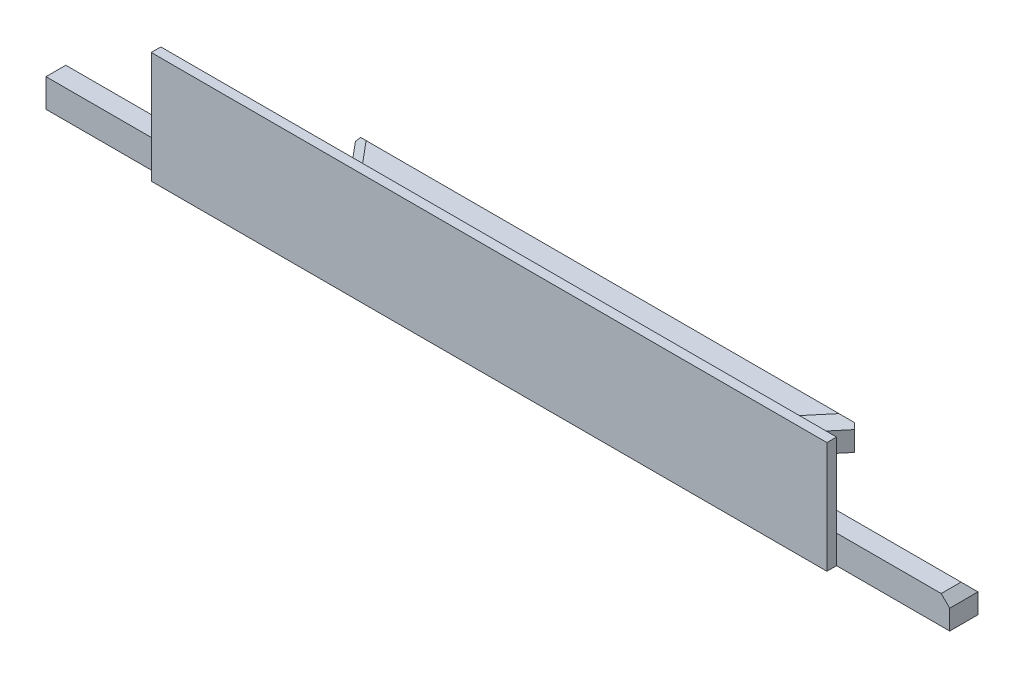
ISO-10303-21;
HEADER;
FILE_DESCRIPTION(('STEP AP214'),'2;1');
FILE_NAME('part.step','',(''),(''),'','','');
FILE_SCHEMA(('AUTOMOTIVE_DESIGN { 1 0 10303 214 1 1 1 1 }'));
ENDSEC;
DATA;
#1=APPLICATION_CONTEXT('core data for automotive mechanical design processes');
#2=APPLICATION_PROTOCOL_DEFINITION('international standard','automotive_design',2000,#1);
#3=PRODUCT_CONTEXT('',#1,'mechanical');
#4=PRODUCT('Part','Part','',(#3));
#5=PRODUCT_RELATED_PRODUCT_CATEGORY('part','',(#4));
#6=PRODUCT_DEFINITION_FORMATION('','',#4);
#7=PRODUCT_DEFINITION_CONTEXT('part definition',#1,'design');
#8=PRODUCT_DEFINITION('design','',#6,#7);
#9=PRODUCT_DEFINITION_SHAPE('','',#8);
#10=(LENGTH_UNIT() NAMED_UNIT(*) SI_UNIT(.MILLI.,.METRE.));
#11=(NAMED_UNIT(*) PLANE_ANGLE_UNIT() SI_UNIT($,.RADIAN.));
#12=(NAMED_UNIT(*) SI_UNIT($,.STERADIAN.) SOLID_ANGLE_UNIT());
#13=UNCERTAINTY_MEASURE_WITH_UNIT(LENGTH_MEASURE(1.E-05),#10,'distance_accuracy_value','');
#14=(GEOMETRIC_REPRESENTATION_CONTEXT(3) GLOBAL_UNCERTAINTY_ASSIGNED_CONTEXT((#13)) GLOBAL_UNIT_ASSIGNED_CONTEXT((#10,
#11,#12)) REPRESENTATION_CONTEXT('',''));
#15=CARTESIAN_POINT('',(0.,0.,0.));
#16=DIRECTION('',(0.,0.,1.));
#17=DIRECTION('',(1.,0.,0.));
#18=AXIS2_PLACEMENT_3D('',#15,#16,#17);
#19=CARTESIAN_POINT('',(185.4335,74.497,-9.29));
#20=DIRECTION('',(0.,-1.,0.));
#21=DIRECTION('',(0.,0.,-1.));
#22=AXIS2_PLACEMENT_3D('',#19,#20,#21);
#23=PLANE('',#22);
#24=DIRECTION('',(0.707106781186557,0.,0.707106781186539));
#25=VECTOR('',#24,1.);
#26=CARTESIAN_POINT('',(149.670988663526,74.497,-29.9125113364741));
#27=LINE('',#26,#25);
#28=CARTESIAN_POINT('',(149.670988663526,74.497,-29.9125113364741));
#29=VERTEX_POINT('',#28);
#30=CARTESIAN_POINT('',(148.5835,74.497,-31.));
#31=VERTEX_POINT('',#30);
#32=EDGE_CURVE('E354',#29,#31,#27,.F.);
#33=ORIENTED_EDGE('',*,*,#32,.F.);
#34=DIRECTION('',(0.642787609686543,0.,-0.766044443118975));
#35=VECTOR('',#34,1.);
#36=CARTESIAN_POINT('',(137.997005532341,74.497,-16.));
#37=LINE('',#36,#35);
#38=CARTESIAN_POINT('',(139.282580751714,74.497,-17.5320888862379));
#39=VERTEX_POINT('',#38);
#40=EDGE_CURVE('E352',#39,#29,#37,.T.);
#41=ORIENTED_EDGE('',*,*,#40,.F.);
#42=DIRECTION('',(-0.0871557427476733,0.,-0.996194698091744));
#43=VECTOR('',#42,1.);
#44=CARTESIAN_POINT('',(139.416621160774,74.497,-16.));
#45=LINE('',#44,#43);
#46=CARTESIAN_POINT('',(139.416621160774,74.497,-16.));
#47=VERTEX_POINT('',#46);
#48=EDGE_CURVE('E363',#39,#47,#45,.F.);
#49=ORIENTED_EDGE('',*,*,#48,.T.);
#50=DIRECTION('',(-1.,0.,0.));
#51=VECTOR('',#50,1.);
#52=CARTESIAN_POINT('',(0.,74.497,-16.));
#53=LINE('',#52,#51);
#54=CARTESIAN_POINT('',(185.4335,74.497,-16.));
#55=VERTEX_POINT('',#54);
#56=EDGE_CURVE('E347',#55,#47,#53,.T.);
#57=ORIENTED_EDGE('',*,*,#56,.F.);
#58=DIRECTION('',(0.,0.,1.));
#59=VECTOR('',#58,1.);
#60=CARTESIAN_POINT('',(185.4335,74.497,-16.));
#61=LINE('',#60,#59);
#62=CARTESIAN_POINT('',(185.4335,74.497,-11.));
#63=VERTEX_POINT('',#62);
#64=EDGE_CURVE('E366',#55,#63,#61,.T.);
#65=ORIENTED_EDGE('',*,*,#64,.T.);
#66=DIRECTION('',(-1.,0.,0.));
#67=VECTOR('',#66,1.);
#68=CARTESIAN_POINT('',(0.,74.497,-11.));
#69=LINE('',#68,#67);
#70=CARTESIAN_POINT('',(165.4335,74.497,-11.));
#71=VERTEX_POINT('',#70);
#72=EDGE_CURVE('E369',#63,#71,#69,.T.);
#73=ORIENTED_EDGE('',*,*,#72,.T.);
#74=DIRECTION('',(0.,0.,1.));
#75=VECTOR('',#74,1.);
#76=CARTESIAN_POINT('',(165.4335,74.497,-166.552081310409));
#77=LINE('',#76,#75);
#78=CARTESIAN_POINT('',(165.4335,74.497,-9.3));
#79=VERTEX_POINT('',#78);
#80=EDGE_CURVE('E213',#71,#79,#77,.T.);
#81=ORIENTED_EDGE('',*,*,#80,.T.);
#82=DIRECTION('',(-1.,0.,0.));
#83=VECTOR('',#82,1.);
#84=CARTESIAN_POINT('',(0.,74.497,-9.3));
#85=LINE('',#84,#83);
#86=CARTESIAN_POINT('',(46.0335,74.497,-9.3));
#87=VERTEX_POINT('',#86);
#88=EDGE_CURVE('E200',#79,#87,#85,.T.);
#89=ORIENTED_EDGE('',*,*,#88,.T.);
#90=DIRECTION('',(0.,0.,-1.));
#91=VECTOR('',#90,1.);
#92=CARTESIAN_POINT('',(46.0335,74.497,-166.552081310409));
#93=LINE('',#92,#91);
#94=CARTESIAN_POINT('',(46.0335,74.497,-11.));
#95=VERTEX_POINT('',#94);
#96=EDGE_CURVE('E207',#87,#95,#93,.T.);
#97=ORIENTED_EDGE('',*,*,#96,.T.);
#98=DIRECTION('',(-1.,0.,0.));
#99=VECTOR('',#98,1.);
#100=CARTESIAN_POINT('',(0.,74.497,-11.));
#101=LINE('',#100,#99);
#102=CARTESIAN_POINT('',(25.7335,74.497,-11.));
#103=VERTEX_POINT('',#102);
#104=EDGE_CURVE('E361',#95,#103,#101,.T.);
#105=ORIENTED_EDGE('',*,*,#104,.T.);
#106=DIRECTION('',(0.,0.,-1.));
#107=VECTOR('',#106,1.);
#108=CARTESIAN_POINT('',(25.7335,74.497,-9.29));
#109=LINE('',#108,#107);
#110=CARTESIAN_POINT('',(25.7335,74.497,-16.));
#111=VERTEX_POINT('',#110);
#112=EDGE_CURVE('E371',#103,#111,#109,.T.);
#113=ORIENTED_EDGE('',*,*,#112,.T.);
#114=DIRECTION('',(-1.,0.,0.));
#115=VECTOR('',#114,1.);
#116=CARTESIAN_POINT('',(0.,74.497,-16.));
#117=LINE('',#116,#115);
#118=CARTESIAN_POINT('',(71.7503788392264,74.497,-16.));
#119=VERTEX_POINT('',#118);
#120=EDGE_CURVE('E225',#119,#111,#117,.T.);
#121=ORIENTED_EDGE('',*,*,#120,.F.);
#122=DIRECTION('',(-0.0871557427476643,0.,0.996194698091745));
#123=VECTOR('',#122,1.);
#124=CARTESIAN_POINT('',(71.8844192482863,74.497,-17.5320888862379));
#125=LINE('',#124,#123);
#126=CARTESIAN_POINT('',(71.8844192482863,74.497,-17.5320888862379));
#127=VERTEX_POINT('',#126);
#128=EDGE_CURVE('E374',#119,#127,#125,.F.);
#129=ORIENTED_EDGE('',*,*,#128,.T.);
#130=DIRECTION('',(0.642787609686543,0.,0.766044443118975));
#131=VECTOR('',#130,1.);
#132=CARTESIAN_POINT('',(60.5835,74.497,-31.));
#133=LINE('',#132,#131);
#134=CARTESIAN_POINT('',(61.4960113364741,74.497,-29.9125113364741));
#135=VERTEX_POINT('',#134);
#136=EDGE_CURVE('E349',#135,#127,#133,.T.);
#137=ORIENTED_EDGE('',*,*,#136,.F.);
#138=DIRECTION('',(0.707106781186552,0.,-0.707106781186543));
#139=VECTOR('',#138,1.);
#140=CARTESIAN_POINT('',(62.5835,74.497,-31.));
#141=LINE('',#140,#139);
#142=CARTESIAN_POINT('',(62.5835,74.497,-31.));
#143=VERTEX_POINT('',#142);
#144=EDGE_CURVE('E358',#143,#135,#141,.F.);
#145=ORIENTED_EDGE('',*,*,#144,.F.);
#146=DIRECTION('',(-1.,0.,0.));
#147=VECTOR('',#146,1.);
#148=CARTESIAN_POINT('',(150.5835,74.497,-31.));
#149=LINE('',#148,#147);
#150=EDGE_CURVE('E356',#31,#143,#149,.T.);
#151=ORIENTED_EDGE('',*,*,#150,.F.);
#152=EDGE_LOOP('',(#33,#41,#49,#57,#65,#73,#81,#89,#97,#105,#113,#121,#129,#137,#145,#151));
#153=FACE_BOUND('',#152,.T.);
#154=ADVANCED_FACE('F40',(#153),#23,.T.);
#155=CARTESIAN_POINT('',(150.5835,-96.7444379544733,-31.));
#156=DIRECTION('',(0.,0.,-1.));
#157=DIRECTION('',(-1.,0.,0.));
#158=AXIS2_PLACEMENT_3D('',#155,#156,#157);
#159=PLANE('',#158);
#160=DIRECTION('',(0.,-1.,0.));
#161=VECTOR('',#160,1.);
#162=CARTESIAN_POINT('',(148.5835,-96.7444379544733,-31.));
#163=LINE('',#162,#161);
#164=CARTESIAN_POINT('',(148.5835,77.997,-31.));
#165=VERTEX_POINT('',#164);
#166=EDGE_CURVE('E238',#165,#31,#163,.T.);
#167=ORIENTED_EDGE('',*,*,#166,.T.);
#168=ORIENTED_EDGE('',*,*,#150,.T.);
#169=DIRECTION('',(0.,1.,0.));
#170=VECTOR('',#169,1.);
#171=CARTESIAN_POINT('',(62.5835,-96.7444379544733,-31.));
#172=LINE('',#171,#170);
#173=CARTESIAN_POINT('',(62.5835,77.997,-31.));
#174=VERTEX_POINT('',#173);
#175=EDGE_CURVE('E241',#143,#174,#172,.T.);
#176=ORIENTED_EDGE('',*,*,#175,.T.);
#177=DIRECTION('',(1.,0.,0.));
#178=VECTOR('',#177,1.);
#179=CARTESIAN_POINT('',(148.5835,77.997,-31.));
#180=LINE('',#179,#178);
#181=EDGE_CURVE('E298',#174,#165,#180,.T.);
#182=ORIENTED_EDGE('',*,*,#181,.T.);
#183=EDGE_LOOP('',(#167,#168,#176,#182));
#184=FACE_BOUND('',#183,.T.);
#185=ADVANCED_FACE('F394',(#184),#159,.T.);
#186=CARTESIAN_POINT('',(149.670988663526,-96.7444379544733,-29.9125113364741));
#187=DIRECTION('',(-0.707106781186538,0.,0.707106781186556));
#188=DIRECTION('',(0.,1.,0.));
#189=AXIS2_PLACEMENT_3D('',#186,#187,#188);
#190=PLANE('',#189);
#191=DIRECTION('',(0.,1.,0.));
#192=VECTOR('',#191,1.);
#193=CARTESIAN_POINT('',(149.670988663526,-96.7444379544733,-29.9125113364741));
#194=LINE('',#193,#192);
#195=CARTESIAN_POINT('',(149.670988663526,77.997,-29.9125113364741));
#196=VERTEX_POINT('',#195);
#197=EDGE_CURVE('E245',#29,#196,#194,.T.);
#198=ORIENTED_EDGE('',*,*,#197,.F.);
#199=ORIENTED_EDGE('',*,*,#32,.T.);
#200=ORIENTED_EDGE('',*,*,#166,.F.);
#201=DIRECTION('',(-0.577350269189636,-0.577350269189621,-0.577350269189621));
#202=VECTOR('',#201,1.);
#203=CARTESIAN_POINT('',(81.0613464575256,10.4748464575274,-98.5221535424726));
#204=LINE('',#203,#202);
#205=CARTESIAN_POINT('',(149.219529765734,78.6330297657338,-30.3639702342662));
#206=VERTEX_POINT('',#205);
#207=EDGE_CURVE('E293',#165,#206,#204,.F.);
#208=ORIENTED_EDGE('',*,*,#207,.T.);
#209=DIRECTION('',(-0.500952228764619,0.705757556807955,-0.500952228764607));
#210=VECTOR('',#209,1.);
#211=CARTESIAN_POINT('',(222.057492155373,-23.9834263098323,42.4739921553712));
#212=LINE('',#211,#210);
#213=EDGE_CURVE('E295',#206,#196,#212,.F.);
#214=ORIENTED_EDGE('',*,*,#213,.T.);
#215=EDGE_LOOP('',(#198,#199,#200,#208,#214));
#216=FACE_BOUND('',#215,.T.);
#217=ADVANCED_FACE('F398',(#216),#190,.F.);
#218=CARTESIAN_POINT('',(137.997005532341,-96.7444379544733,-16.));
#219=DIRECTION('',(0.766044443118975,0.,0.642787609686543));
#220=DIRECTION('',(0.642787609686543,0.,-0.766044443118975));
#221=AXIS2_PLACEMENT_3D('',#218,#219,#220);
#222=PLANE('',#221);
#223=DIRECTION('',(0.,-1.,0.));
#224=VECTOR('',#223,1.);
#225=CARTESIAN_POINT('',(139.282580751714,-5.50299999999999,-17.5320888862379));
#226=LINE('',#225,#224);
#227=CARTESIAN_POINT('',(139.282580751714,77.997,-17.5320888862379));
#228=VERTEX_POINT('',#227);
#229=EDGE_CURVE('E243',#228,#39,#226,.T.);
#230=ORIENTED_EDGE('',*,*,#229,.T.);
#231=ORIENTED_EDGE('',*,*,#40,.T.);
#232=ORIENTED_EDGE('',*,*,#197,.T.);
#233=DIRECTION('',(-0.642787609686543,0.,0.766044443118975));
#234=VECTOR('',#233,1.);
#235=CARTESIAN_POINT('',(139.282580751714,77.997,-17.5320888862379));
#236=LINE('',#235,#234);
#237=EDGE_CURVE('E290',#196,#228,#236,.T.);
#238=ORIENTED_EDGE('',*,*,#237,.T.);
#239=EDGE_LOOP('',(#230,#231,#232,#238));
#240=FACE_BOUND('',#239,.T.);
#241=ADVANCED_FACE('F402',(#240),#222,.T.);
#242=CARTESIAN_POINT('',(62.5835,-96.7444379544733,-31.));
#243=DIRECTION('',(0.707106781186543,0.,0.707106781186552));
#244=DIRECTION('',(0.,1.,0.));
#245=AXIS2_PLACEMENT_3D('',#242,#243,#244);
#246=PLANE('',#245);
#247=ORIENTED_EDGE('',*,*,#175,.F.);
#248=ORIENTED_EDGE('',*,*,#144,.T.);
#249=DIRECTION('',(0.,-1.,0.));
#250=VECTOR('',#249,1.);
#251=CARTESIAN_POINT('',(61.4960113364741,-96.7444379544733,-29.9125113364741));
#252=LINE('',#251,#250);
#253=CARTESIAN_POINT('',(61.4960113364741,77.997,-29.9125113364741));
#254=VERTEX_POINT('',#253);
#255=EDGE_CURVE('E231',#254,#135,#252,.T.);
#256=ORIENTED_EDGE('',*,*,#255,.F.);
#257=DIRECTION('',(-0.500952228764616,-0.705757556807956,0.500952228764609));
#258=VECTOR('',#257,1.);
#259=CARTESIAN_POINT('',(-10.3446747754983,-23.2144612900873,41.9281747754974));
#260=LINE('',#259,#258);
#261=CARTESIAN_POINT('',(61.9474702342662,78.6330297657338,-30.3639702342662));
#262=VERTEX_POINT('',#261);
#263=EDGE_CURVE('E301',#254,#262,#260,.F.);
#264=ORIENTED_EDGE('',*,*,#263,.T.);
#265=DIRECTION('',(-0.577350269189631,0.577350269189623,0.577350269189623));
#266=VECTOR('',#265,1.);
#267=CARTESIAN_POINT('',(130.830645984825,9.74985401517617,-99.2471459848238));
#268=LINE('',#267,#266);
#269=EDGE_CURVE('E303',#262,#174,#268,.F.);
#270=ORIENTED_EDGE('',*,*,#269,.T.);
#271=EDGE_LOOP('',(#247,#248,#256,#264,#270));
#272=FACE_BOUND('',#271,.T.);
#273=ADVANCED_FACE('F388',(#272),#246,.F.);
#274=CARTESIAN_POINT('',(60.5835,-96.7444379544733,-31.));
#275=DIRECTION('',(-0.766044443118975,0.,0.642787609686543));
#276=DIRECTION('',(0.642787609686543,0.,0.766044443118975));
#277=AXIS2_PLACEMENT_3D('',#274,#275,#276);
#278=PLANE('',#277);
#279=ORIENTED_EDGE('',*,*,#255,.T.);
#280=ORIENTED_EDGE('',*,*,#136,.T.);
#281=DIRECTION('',(0.,1.,0.));
#282=VECTOR('',#281,1.);
#283=CARTESIAN_POINT('',(71.8844192482863,109.497,-17.5320888862379));
#284=LINE('',#283,#282);
#285=CARTESIAN_POINT('',(71.8844192482863,77.997,-17.5320888862379));
#286=VERTEX_POINT('',#285);
#287=EDGE_CURVE('E234',#127,#286,#284,.T.);
#288=ORIENTED_EDGE('',*,*,#287,.T.);
#289=DIRECTION('',(-0.642787609686543,0.,-0.766044443118975));
#290=VECTOR('',#289,1.);
#291=CARTESIAN_POINT('',(61.4960113364741,77.997,-29.9125113364741));
#292=LINE('',#291,#290);
#293=EDGE_CURVE('E306',#286,#254,#292,.T.);
#294=ORIENTED_EDGE('',*,*,#293,.T.);
#295=EDGE_LOOP('',(#279,#280,#288,#294));
#296=FACE_BOUND('',#295,.T.);
#297=ADVANCED_FACE('F384',(#296),#278,.T.);
#298=CARTESIAN_POINT('',(0.,0.,-16.));
#299=DIRECTION('',(0.,0.,-1.));
#300=DIRECTION('',(-1.,0.,0.));
#301=AXIS2_PLACEMENT_3D('',#298,#299,#300);
#302=PLANE('',#301);
#303=DIRECTION('',(0.,-1.,0.));
#304=VECTOR('',#303,1.);
#305=CARTESIAN_POINT('',(71.7503788392264,-5.50299999999999,-16.));
#306=LINE('',#305,#304);
#307=CARTESIAN_POINT('',(71.7503788392264,77.997,-16.));
#308=VERTEX_POINT('',#307);
#309=EDGE_CURVE('E236',#308,#119,#306,.T.);
#310=ORIENTED_EDGE('',*,*,#309,.T.);
#311=ORIENTED_EDGE('',*,*,#120,.T.);
#312=DIRECTION('',(0.,1.,0.));
#313=VECTOR('',#312,1.);
#314=CARTESIAN_POINT('',(25.7335,109.497,-16.));
#315=LINE('',#314,#313);
#316=CARTESIAN_POINT('',(25.7335,77.997,-16.));
#317=VERTEX_POINT('',#316);
#318=EDGE_CURVE('E229',#111,#317,#315,.T.);
#319=ORIENTED_EDGE('',*,*,#318,.T.);
#320=DIRECTION('',(1.,0.,0.));
#321=VECTOR('',#320,1.);
#322=CARTESIAN_POINT('',(71.7503788392264,77.997,-16.));
#323=LINE('',#322,#321);
#324=EDGE_CURVE('E331',#317,#308,#323,.T.);
#325=ORIENTED_EDGE('',*,*,#324,.T.);
#326=EDGE_LOOP('',(#310,#311,#319,#325));
#327=FACE_BOUND('',#326,.T.);
#328=ADVANCED_FACE('F438',(#327),#302,.T.);
#329=CARTESIAN_POINT('',(120.703637321413,79.497,38.3148038997593));
#330=DIRECTION('',(-0.541675220419702,0.707106781186544,0.454519477672049));
#331=DIRECTION('',(-0.642787609686543,0.,-0.766044443118975));
#332=AXIS2_PLACEMENT_3D('',#329,#330,#331);
#333=PLANE('',#332);
#334=ORIENTED_EDGE('',*,*,#263,.F.);
#335=ORIENTED_EDGE('',*,*,#293,.F.);
#336=DIRECTION('',(0.7005142133454,0.678598344545849,-0.220871283060313));
#337=VECTOR('',#336,1.);
#338=CARTESIAN_POINT('',(74.9586457992077,80.9750481373124,-18.501388794483));
#339=LINE('',#338,#337);
#340=CARTESIAN_POINT('',(73.4328629314511,79.497,-18.0203113041871));
#341=VERTEX_POINT('',#340);
#342=EDGE_CURVE('E273',#341,#286,#339,.F.);
#343=ORIENTED_EDGE('',*,*,#342,.F.);
#344=DIRECTION('',(0.642787609686543,0.,0.766044443118975));
#345=VECTOR('',#344,1.);
#346=CARTESIAN_POINT('',(73.0334859129647,79.497,-18.4962703007677));
#347=LINE('',#346,#345);
#348=CARTESIAN_POINT('',(63.8002603807643,79.497,-29.5));
#349=VERTEX_POINT('',#348);
#350=EDGE_CURVE('E319',#349,#341,#347,.T.);
#351=ORIENTED_EDGE('',*,*,#350,.F.);
#352=DIRECTION('',(0.834817129478988,0.389281620635025,0.389281620635025));
#353=VECTOR('',#352,1.);
#354=CARTESIAN_POINT('',(148.568853908284,119.025244332911,10.0282443329105));
#355=LINE('',#354,#353);
#356=EDGE_CURVE('E270',#349,#262,#355,.F.);
#357=ORIENTED_EDGE('',*,*,#356,.T.);
#358=EDGE_LOOP('',(#334,#335,#343,#351,#357));
#359=FACE_BOUND('',#358,.T.);
#360=ADVANCED_FACE('F449',(#359),#333,.T.);
#361=CARTESIAN_POINT('',(185.4335,79.497,-29.5));
#362=DIRECTION('',(0.,0.707106781186547,-0.707106781186547));
#363=DIRECTION('',(1.,0.,0.));
#364=AXIS2_PLACEMENT_3D('',#361,#362,#363);
#365=PLANE('',#364);
#366=ORIENTED_EDGE('',*,*,#181,.F.);
#367=ORIENTED_EDGE('',*,*,#269,.F.);
#368=ORIENTED_EDGE('',*,*,#356,.F.);
#369=DIRECTION('',(-1.,0.,0.));
#370=VECTOR('',#369,1.);
#371=CARTESIAN_POINT('',(62.5835,79.497,-29.5));
#372=LINE('',#371,#370);
#373=CARTESIAN_POINT('',(147.366739619236,79.497,-29.5));
#374=VERTEX_POINT('',#373);
#375=EDGE_CURVE('E321',#374,#349,#372,.T.);
#376=ORIENTED_EDGE('',*,*,#375,.F.);
#377=DIRECTION('',(-0.834817129478988,0.389281620635024,0.389281620635024));
#378=VECTOR('',#377,1.);
#379=CARTESIAN_POINT('',(157.212291975728,74.9059435374016,-34.0910564625984));
#380=LINE('',#379,#378);
#381=EDGE_CURVE('E267',#374,#206,#380,.F.);
#382=ORIENTED_EDGE('',*,*,#381,.T.);
#383=ORIENTED_EDGE('',*,*,#207,.F.);
#384=EDGE_LOOP('',(#366,#367,#368,#376,#382,#383));
#385=FACE_BOUND('',#384,.T.);
#386=ADVANCED_FACE('F453',(#385),#365,.T.);
#387=CARTESIAN_POINT('',(156.447555691884,79.497,-40.3220951782657));
#388=DIRECTION('',(0.541675220419701,0.707106781186545,0.454519477672048));
#389=DIRECTION('',(-0.642787609686543,0.,0.766044443118975));
#390=AXIS2_PLACEMENT_3D('',#387,#388,#389);
#391=PLANE('',#390);
#392=ORIENTED_EDGE('',*,*,#237,.F.);
#393=ORIENTED_EDGE('',*,*,#213,.F.);
#394=ORIENTED_EDGE('',*,*,#381,.F.);
#395=DIRECTION('',(0.642787609686543,0.,-0.766044443118975));
#396=VECTOR('',#395,1.);
#397=CARTESIAN_POINT('',(148.521921998847,79.497,-30.8766927510039));
#398=LINE('',#397,#396);
#399=CARTESIAN_POINT('',(137.734137068549,79.497,-18.0203113041871));
#400=VERTEX_POINT('',#399);
#401=EDGE_CURVE('E323',#400,#374,#398,.T.);
#402=ORIENTED_EDGE('',*,*,#401,.F.);
#403=DIRECTION('',(-0.7005142133454,0.678598344545848,-0.220871283060315));
#404=VECTOR('',#403,1.);
#405=CARTESIAN_POINT('',(143.466579450127,73.9438993830029,-16.2128791639569));
#406=LINE('',#405,#404);
#407=EDGE_CURVE('E264',#400,#228,#406,.F.);
#408=ORIENTED_EDGE('',*,*,#407,.T.);
#409=EDGE_LOOP('',(#392,#393,#394,#402,#408));
#410=FACE_BOUND('',#409,.T.);
#411=ADVANCED_FACE('F457',(#410),#391,.T.);
#412=CARTESIAN_POINT('',(138.271879008103,79.497,-11.873892809702));
#413=DIRECTION('',(0.70441602640276,0.707106781186545,-0.0616284167162302));
#414=DIRECTION('',(0.0871557427476733,0.,0.996194698091744));
#415=AXIS2_PLACEMENT_3D('',#412,#413,#414);
#416=PLANE('',#415);
#417=DIRECTION('',(-0.543774795917189,0.59342605745165,0.59342605745165));
#418=VECTOR('',#417,1.);
#419=CARTESIAN_POINT('',(137.262641896983,80.3476558817019,-13.6493441182981));
#420=LINE('',#419,#418);
#421=CARTESIAN_POINT('',(138.042124399748,79.497,-14.5));
#422=VERTEX_POINT('',#421);
#423=CARTESIAN_POINT('',(139.416621160774,77.997,-16.));
#424=VERTEX_POINT('',#423);
#425=EDGE_CURVE('E260',#422,#424,#420,.F.);
#426=ORIENTED_EDGE('',*,*,#425,.T.);
#427=DIRECTION('',(-0.0871557427476733,0.,-0.996194698091744));
#428=VECTOR('',#427,1.);
#429=CARTESIAN_POINT('',(139.416621160774,77.997,-16.));
#430=LINE('',#429,#428);
#431=EDGE_CURVE('E287',#228,#424,#430,.F.);
#432=ORIENTED_EDGE('',*,*,#431,.F.);
#433=ORIENTED_EDGE('',*,*,#407,.F.);
#434=DIRECTION('',(-0.0871557427476733,0.,-0.996194698091744));
#435=VECTOR('',#434,1.);
#436=CARTESIAN_POINT('',(138.271879008103,79.497,-11.873892809702));
#437=LINE('',#436,#435);
#438=EDGE_CURVE('E325',#422,#400,#437,.T.);
#439=ORIENTED_EDGE('',*,*,#438,.F.);
#440=EDGE_LOOP('',(#426,#432,#433,#439));
#441=FACE_BOUND('',#440,.T.);
#442=ADVANCED_FACE('F461',(#441),#416,.T.);
#443=CARTESIAN_POINT('',(0.,77.997,-16.));
#444=DIRECTION('',(0.,0.707106781186547,-0.707106781186547));
#445=DIRECTION('',(-1.,0.,0.));
#446=AXIS2_PLACEMENT_3D('',#443,#444,#445);
#447=PLANE('',#446);
#448=DIRECTION('',(0.577350269189626,-0.577350269189626,-0.577350269189626));
#449=VECTOR('',#448,1.);
#450=CARTESIAN_POINT('',(185.4335,77.997,-16.));
#451=LINE('',#450,#449);
#452=CARTESIAN_POINT('',(183.9335,79.497,-14.5));
#453=VERTEX_POINT('',#452);
#454=CARTESIAN_POINT('',(185.4335,77.997,-16.));
#455=VERTEX_POINT('',#454);
#456=EDGE_CURVE('E257',#453,#455,#451,.T.);
#457=ORIENTED_EDGE('',*,*,#456,.T.);
#458=DIRECTION('',(1.,0.,0.));
#459=VECTOR('',#458,1.);
#460=CARTESIAN_POINT('',(185.4335,77.997,-16.));
#461=LINE('',#460,#459);
#462=EDGE_CURVE('E284',#424,#455,#461,.T.);
#463=ORIENTED_EDGE('',*,*,#462,.F.);
#464=ORIENTED_EDGE('',*,*,#425,.F.);
#465=DIRECTION('',(-1.,0.,0.));
#466=VECTOR('',#465,1.);
#467=CARTESIAN_POINT('',(139.416621160774,79.497,-14.5));
#468=LINE('',#467,#466);
#469=EDGE_CURVE('E327',#453,#422,#468,.T.);
#470=ORIENTED_EDGE('',*,*,#469,.F.);
#471=EDGE_LOOP('',(#457,#463,#464,#470));
#472=FACE_BOUND('',#471,.T.);
#473=ADVANCED_FACE('F465',(#472),#447,.T.);
#474=CARTESIAN_POINT('',(185.4335,77.997,-16.));
#475=DIRECTION('',(-0.707106781186547,-0.707106781186547,0.));
#476=DIRECTION('',(0.,0.,1.));
#477=AXIS2_PLACEMENT_3D('',#474,#475,#476);
#478=PLANE('',#477);
#479=DIRECTION('',(0.707106781186548,-0.707106781186548,0.));
#480=VECTOR('',#479,1.);
#481=CARTESIAN_POINT('',(185.4335,77.997,-11.));
#482=LINE('',#481,#480);
#483=CARTESIAN_POINT('',(185.4335,77.997,-11.));
#484=VERTEX_POINT('',#483);
#485=CARTESIAN_POINT('',(183.9335,79.497,-11.));
#486=VERTEX_POINT('',#485);
#487=EDGE_CURVE('E278',#484,#486,#482,.F.);
#488=ORIENTED_EDGE('',*,*,#487,.F.);
#489=DIRECTION('',(0.,0.,1.));
#490=VECTOR('',#489,1.);
#491=CARTESIAN_POINT('',(185.4335,77.997,-16.));
#492=LINE('',#491,#490);
#493=EDGE_CURVE('E281',#455,#484,#492,.T.);
#494=ORIENTED_EDGE('',*,*,#493,.F.);
#495=ORIENTED_EDGE('',*,*,#456,.F.);
#496=DIRECTION('',(0.,0.,-1.));
#497=VECTOR('',#496,1.);
#498=CARTESIAN_POINT('',(183.9335,79.497,-16.));
#499=LINE('',#498,#497);
#500=EDGE_CURVE('E329',#486,#453,#499,.T.);
#501=ORIENTED_EDGE('',*,*,#500,.F.);
#502=EDGE_LOOP('',(#488,#494,#495,#501));
#503=FACE_BOUND('',#502,.T.);
#504=ADVANCED_FACE('F468',(#503),#478,.F.);
#505=CARTESIAN_POINT('',(0.,77.997,-16.));
#506=DIRECTION('',(0.,0.707106781186547,-0.707106781186547));
#507=DIRECTION('',(-1.,0.,0.));
#508=AXIS2_PLACEMENT_3D('',#505,#506,#507);
#509=PLANE('',#508);
#510=DIRECTION('',(0.,-0.707106781186548,-0.707106781186548));
#511=VECTOR('',#510,1.);
#512=CARTESIAN_POINT('',(25.7335,77.997,-16.));
#513=LINE('',#512,#511);
#514=CARTESIAN_POINT('',(25.7335,79.497,-14.5));
#515=VERTEX_POINT('',#514);
#516=EDGE_CURVE('E312',#515,#317,#513,.T.);
#517=ORIENTED_EDGE('',*,*,#516,.F.);
#518=DIRECTION('',(-1.,0.,0.));
#519=VECTOR('',#518,1.);
#520=CARTESIAN_POINT('',(25.7335,79.497,-14.5));
#521=LINE('',#520,#519);
#522=CARTESIAN_POINT('',(73.1248756002525,79.497,-14.5));
#523=VERTEX_POINT('',#522);
#524=EDGE_CURVE('E315',#523,#515,#521,.T.);
#525=ORIENTED_EDGE('',*,*,#524,.F.);
#526=DIRECTION('',(0.543774795917194,0.593426057451648,0.593426057451648));
#527=VECTOR('',#526,1.);
#528=CARTESIAN_POINT('',(50.5344355124499,54.8438606892847,-39.1531393107153));
#529=LINE('',#528,#527);
#530=EDGE_CURVE('E205',#523,#308,#529,.F.);
#531=ORIENTED_EDGE('',*,*,#530,.T.);
#532=ORIENTED_EDGE('',*,*,#324,.F.);
#533=EDGE_LOOP('',(#517,#525,#531,#532));
#534=FACE_BOUND('',#533,.T.);
#535=ADVANCED_FACE('F440',(#534),#509,.T.);
#536=CARTESIAN_POINT('',(74.1082219138729,79.497,-25.7396997964078));
#537=DIRECTION('',(-0.70441602640276,0.707106781186546,-0.0616284167162238));
#538=DIRECTION('',(0.0871557427476643,0.,-0.996194698091745));
#539=AXIS2_PLACEMENT_3D('',#536,#537,#538);
#540=PLANE('',#539);
#541=ORIENTED_EDGE('',*,*,#342,.T.);
#542=DIRECTION('',(-0.0871557427476643,0.,0.996194698091745));
#543=VECTOR('',#542,1.);
#544=CARTESIAN_POINT('',(71.8844192482863,77.997,-17.5320888862379));
#545=LINE('',#544,#543);
#546=EDGE_CURVE('E309',#308,#286,#545,.F.);
#547=ORIENTED_EDGE('',*,*,#546,.F.);
#548=ORIENTED_EDGE('',*,*,#530,.F.);
#549=DIRECTION('',(-0.0871557427476643,0.,0.996194698091745));
#550=VECTOR('',#549,1.);
#551=CARTESIAN_POINT('',(74.1082219138729,79.497,-25.7396997964078));
#552=LINE('',#551,#550);
#553=EDGE_CURVE('E317',#341,#523,#552,.T.);
#554=ORIENTED_EDGE('',*,*,#553,.F.);
#555=EDGE_LOOP('',(#541,#547,#548,#554));
#556=FACE_BOUND('',#555,.T.);
#557=ADVANCED_FACE('F445',(#556),#540,.T.);
#558=CARTESIAN_POINT('',(185.4335,79.497,-16.));
#559=DIRECTION('',(0.,-1.,0.));
#560=DIRECTION('',(0.,0.,-1.));
#561=AXIS2_PLACEMENT_3D('',#558,#559,#560);
#562=PLANE('',#561);
#563=ORIENTED_EDGE('',*,*,#553,.T.);
#564=ORIENTED_EDGE('',*,*,#524,.T.);
#565=DIRECTION('',(0.,0.,1.));
#566=VECTOR('',#565,1.);
#567=CARTESIAN_POINT('',(25.7335,79.497,-16.));
#568=LINE('',#567,#566);
#569=CARTESIAN_POINT('',(25.7335,79.497,-11.));
#570=VERTEX_POINT('',#569);
#571=EDGE_CURVE('E334',#515,#570,#568,.T.);
#572=ORIENTED_EDGE('',*,*,#571,.T.);
#573=DIRECTION('',(1.,0.,0.));
#574=VECTOR('',#573,1.);
#575=CARTESIAN_POINT('',(185.4335,79.497,-11.));
#576=LINE('',#575,#574);
#577=CARTESIAN_POINT('',(46.0335,79.497,-11.));
#578=VERTEX_POINT('',#577);
#579=EDGE_CURVE('E337',#570,#578,#576,.T.);
#580=ORIENTED_EDGE('',*,*,#579,.T.);
#581=CARTESIAN_POINT('',(165.4335,79.497,-11.));
#582=VERTEX_POINT('',#581);
#583=EDGE_CURVE('E340',#578,#582,#576,.T.);
#584=ORIENTED_EDGE('',*,*,#583,.T.);
#585=EDGE_CURVE('E261',#582,#486,#576,.T.);
#586=ORIENTED_EDGE('',*,*,#585,.T.);
#587=ORIENTED_EDGE('',*,*,#500,.T.);
#588=ORIENTED_EDGE('',*,*,#469,.T.);
#589=ORIENTED_EDGE('',*,*,#438,.T.);
#590=ORIENTED_EDGE('',*,*,#401,.T.);
#591=ORIENTED_EDGE('',*,*,#375,.T.);
#592=ORIENTED_EDGE('',*,*,#350,.T.);
#593=EDGE_LOOP('',(#563,#564,#572,#580,#584,#586,#587,#588,#589,#590,#591,#592));
#594=FACE_BOUND('',#593,.T.);
#595=ADVANCED_FACE('F429',(#594),#562,.F.);
#596=CARTESIAN_POINT('',(0.,0.,-11.));
#597=DIRECTION('',(0.,0.,-1.));
#598=DIRECTION('',(-1.,0.,0.));
#599=AXIS2_PLACEMENT_3D('',#596,#597,#598);
#600=PLANE('',#599);
#601=ORIENTED_EDGE('',*,*,#104,.F.);
#602=DIRECTION('',(0.,1.,0.));
#603=VECTOR('',#602,1.);
#604=CARTESIAN_POINT('',(46.0335,-5.50299999999999,-11.));
#605=LINE('',#604,#603);
#606=EDGE_CURVE('E209',#95,#578,#605,.T.);
#607=ORIENTED_EDGE('',*,*,#606,.T.);
#608=ORIENTED_EDGE('',*,*,#579,.F.);
#609=DIRECTION('',(0.,1.,0.));
#610=VECTOR('',#609,1.);
#611=CARTESIAN_POINT('',(25.7335,109.497,-11.));
#612=LINE('',#611,#610);
#613=EDGE_CURVE('E224',#103,#570,#612,.T.);
#614=ORIENTED_EDGE('',*,*,#613,.F.);
#615=EDGE_LOOP('',(#601,#607,#608,#614));
#616=FACE_BOUND('',#615,.T.);
#617=ADVANCED_FACE('F432',(#616),#600,.F.);
#618=CARTESIAN_POINT('',(46.0335,-5.51299999999999,-11.));
#619=DIRECTION('',(0.,0.,-1.));
#620=DIRECTION('',(-1.,0.,0.));
#621=AXIS2_PLACEMENT_3D('',#618,#619,#620);
#622=PLANE('',#621);
#623=ORIENTED_EDGE('',*,*,#583,.F.);
#624=CARTESIAN_POINT('',(46.0335,94.197,-11.));
#625=VERTEX_POINT('',#624);
#626=EDGE_CURVE('E11',#578,#625,#605,.T.);
#627=ORIENTED_EDGE('',*,*,#626,.T.);
#628=DIRECTION('',(1.,0.,0.));
#629=VECTOR('',#628,1.);
#630=CARTESIAN_POINT('',(46.0335,94.197,-11.));
#631=LINE('',#630,#629);
#632=CARTESIAN_POINT('',(165.4335,94.197,-11.));
#633=VERTEX_POINT('',#632);
#634=EDGE_CURVE('E49',#625,#633,#631,.T.);
#635=ORIENTED_EDGE('',*,*,#634,.T.);
#636=DIRECTION('',(0.,-1.,0.));
#637=VECTOR('',#636,1.);
#638=CARTESIAN_POINT('',(165.4335,94.197,-11.));
#639=LINE('',#638,#637);
#640=EDGE_CURVE('E250',#633,#582,#639,.T.);
#641=ORIENTED_EDGE('',*,*,#640,.T.);
#642=EDGE_LOOP('',(#623,#627,#635,#641));
#643=FACE_BOUND('',#642,.T.);
#644=ADVANCED_FACE('F426',(#643),#622,.T.);
#645=ORIENTED_EDGE('',*,*,#72,.F.);
#646=DIRECTION('',(0.,-1.,0.));
#647=VECTOR('',#646,1.);
#648=CARTESIAN_POINT('',(185.4335,109.497,-11.));
#649=LINE('',#648,#647);
#650=EDGE_CURVE('E222',#484,#63,#649,.T.);
#651=ORIENTED_EDGE('',*,*,#650,.F.);
#652=ORIENTED_EDGE('',*,*,#487,.T.);
#653=ORIENTED_EDGE('',*,*,#585,.F.);
#654=EDGE_CURVE('E249',#582,#71,#639,.T.);
#655=ORIENTED_EDGE('',*,*,#654,.T.);
#656=EDGE_LOOP('',(#645,#651,#652,#653,#655));
#657=FACE_BOUND('',#656,.T.);
#658=ADVANCED_FACE('F419',(#657),#600,.F.);
#659=CARTESIAN_POINT('',(46.0335,-5.50299999999999,-166.552081310409));
#660=DIRECTION('',(1.,0.,0.));
#661=DIRECTION('',(0.,1.,0.));
#662=AXIS2_PLACEMENT_3D('',#659,#660,#661);
#663=PLANE('',#662);
#664=ORIENTED_EDGE('',*,*,#96,.F.);
#665=DIRECTION('',(0.,1.,0.));
#666=VECTOR('',#665,1.);
#667=CARTESIAN_POINT('',(46.0335,-5.50299999999999,-9.3));
#668=LINE('',#667,#666);
#669=CARTESIAN_POINT('',(46.0335,94.197,-9.3));
#670=VERTEX_POINT('',#669);
#671=EDGE_CURVE('E195',#87,#670,#668,.T.);
#672=ORIENTED_EDGE('',*,*,#671,.T.);
#673=DIRECTION('',(0.,0.,1.));
#674=VECTOR('',#673,1.);
#675=CARTESIAN_POINT('',(46.0335,94.197,-166.552081310409));
#676=LINE('',#675,#674);
#677=EDGE_CURVE('E204',#625,#670,#676,.T.);
#678=ORIENTED_EDGE('',*,*,#677,.F.);
#679=ORIENTED_EDGE('',*,*,#626,.F.);
#680=ORIENTED_EDGE('',*,*,#606,.F.);
#681=EDGE_LOOP('',(#664,#672,#678,#679,#680));
#682=FACE_BOUND('',#681,.T.);
#683=ADVANCED_FACE('F208',(#682),#663,.F.);
#684=CARTESIAN_POINT('',(165.4335,94.197,-166.552081310409));
#685=DIRECTION('',(-1.,0.,0.));
#686=DIRECTION('',(0.,-1.,0.));
#687=AXIS2_PLACEMENT_3D('',#684,#685,#686);
#688=PLANE('',#687);
#689=ORIENTED_EDGE('',*,*,#80,.F.);
#690=ORIENTED_EDGE('',*,*,#654,.F.);
#691=ORIENTED_EDGE('',*,*,#640,.F.);
#692=DIRECTION('',(0.,0.,1.));
#693=VECTOR('',#692,1.);
#694=CARTESIAN_POINT('',(165.4335,94.197,-166.552081310409));
#695=LINE('',#694,#693);
#696=CARTESIAN_POINT('',(165.4335,94.197,-9.3));
#697=VERTEX_POINT('',#696);
#698=EDGE_CURVE('E63',#633,#697,#695,.T.);
#699=ORIENTED_EDGE('',*,*,#698,.T.);
#700=DIRECTION('',(0.,-1.,0.));
#701=VECTOR('',#700,1.);
#702=CARTESIAN_POINT('',(165.4335,94.197,-9.3));
#703=LINE('',#702,#701);
#704=EDGE_CURVE('E44',#697,#79,#703,.T.);
#705=ORIENTED_EDGE('',*,*,#704,.T.);
#706=EDGE_LOOP('',(#689,#690,#691,#699,#705));
#707=FACE_BOUND('',#706,.T.);
#708=ADVANCED_FACE('F423',(#707),#688,.F.);
#709=CARTESIAN_POINT('',(0.,0.,-9.3));
#710=DIRECTION('',(0.,0.,-1.));
#711=DIRECTION('',(-1.,0.,0.));
#712=AXIS2_PLACEMENT_3D('',#709,#710,#711);
#713=PLANE('',#712);
#714=ORIENTED_EDGE('',*,*,#88,.F.);
#715=ORIENTED_EDGE('',*,*,#704,.F.);
#716=DIRECTION('',(1.,0.,0.));
#717=VECTOR('',#716,1.);
#718=CARTESIAN_POINT('',(46.0335,94.197,-9.3));
#719=LINE('',#718,#717);
#720=EDGE_CURVE('E201',#670,#697,#719,.T.);
#721=ORIENTED_EDGE('',*,*,#720,.F.);
#722=ORIENTED_EDGE('',*,*,#671,.F.);
#723=EDGE_LOOP('',(#714,#715,#721,#722));
#724=FACE_BOUND('',#723,.T.);
#725=ADVANCED_FACE('F197',(#724),#713,.F.);
#726=CARTESIAN_POINT('',(71.8844192482863,-96.7444379544733,-17.5320888862379));
#727=DIRECTION('',(-0.996194698091745,0.,-0.0871557427476643));
#728=DIRECTION('',(0.,-1.,0.));
#729=AXIS2_PLACEMENT_3D('',#726,#727,#728);
#730=PLANE('',#729);
#731=ORIENTED_EDGE('',*,*,#128,.F.);
#732=ORIENTED_EDGE('',*,*,#309,.F.);
#733=ORIENTED_EDGE('',*,*,#546,.T.);
#734=ORIENTED_EDGE('',*,*,#287,.F.);
#735=EDGE_LOOP('',(#731,#732,#733,#734));
#736=FACE_BOUND('',#735,.T.);
#737=ADVANCED_FACE('F380',(#736),#730,.T.);
#738=CARTESIAN_POINT('',(139.416621160774,0.,-16.));
#739=DIRECTION('',(0.996194698091744,0.,-0.0871557427476733));
#740=DIRECTION('',(0.,-1.,0.));
#741=AXIS2_PLACEMENT_3D('',#738,#739,#740);
#742=PLANE('',#741);
#743=ORIENTED_EDGE('',*,*,#48,.F.);
#744=ORIENTED_EDGE('',*,*,#229,.F.);
#745=ORIENTED_EDGE('',*,*,#431,.T.);
#746=DIRECTION('',(0.,1.,0.));
#747=VECTOR('',#746,1.);
#748=CARTESIAN_POINT('',(139.416621160774,109.497,-16.));
#749=LINE('',#748,#747);
#750=EDGE_CURVE('E247',#47,#424,#749,.T.);
#751=ORIENTED_EDGE('',*,*,#750,.F.);
#752=EDGE_LOOP('',(#743,#744,#745,#751));
#753=FACE_BOUND('',#752,.T.);
#754=ADVANCED_FACE('F408',(#753),#742,.T.);
#755=DIRECTION('',(0.,-1.,0.));
#756=VECTOR('',#755,1.);
#757=CARTESIAN_POINT('',(185.4335,109.497,-16.));
#758=LINE('',#757,#756);
#759=EDGE_CURVE('E227',#455,#55,#758,.T.);
#760=ORIENTED_EDGE('',*,*,#759,.T.);
#761=ORIENTED_EDGE('',*,*,#56,.T.);
#762=ORIENTED_EDGE('',*,*,#750,.T.);
#763=ORIENTED_EDGE('',*,*,#462,.T.);
#764=EDGE_LOOP('',(#760,#761,#762,#763));
#765=FACE_BOUND('',#764,.T.);
#766=ADVANCED_FACE('F411',(#765),#302,.T.);
#767=CARTESIAN_POINT('',(46.0335,94.197,-166.552081310409));
#768=DIRECTION('',(0.,-1.,0.));
#769=DIRECTION('',(0.,0.,-1.));
#770=AXIS2_PLACEMENT_3D('',#767,#768,#769);
#771=PLANE('',#770);
#772=ORIENTED_EDGE('',*,*,#634,.F.);
#773=ORIENTED_EDGE('',*,*,#677,.T.);
#774=ORIENTED_EDGE('',*,*,#720,.T.);
#775=ORIENTED_EDGE('',*,*,#698,.F.);
#776=EDGE_LOOP('',(#772,#773,#774,#775));
#777=FACE_BOUND('',#776,.T.);
#778=ADVANCED_FACE('F424',(#777),#771,.F.);
#779=CARTESIAN_POINT('',(25.7335,109.497,-16.));
#780=DIRECTION('',(1.,0.,0.));
#781=DIRECTION('',(0.,1.,0.));
#782=AXIS2_PLACEMENT_3D('',#779,#780,#781);
#783=PLANE('',#782);
#784=ORIENTED_EDGE('',*,*,#112,.F.);
#785=ORIENTED_EDGE('',*,*,#613,.T.);
#786=ORIENTED_EDGE('',*,*,#571,.F.);
#787=ORIENTED_EDGE('',*,*,#516,.T.);
#788=ORIENTED_EDGE('',*,*,#318,.F.);
#789=EDGE_LOOP('',(#784,#785,#786,#787,#788));
#790=FACE_BOUND('',#789,.T.);
#791=ADVANCED_FACE('F42',(#790),#783,.F.);
#792=CARTESIAN_POINT('',(185.4335,109.497,-16.));
#793=DIRECTION('',(-1.,0.,0.));
#794=DIRECTION('',(0.,0.,1.));
#795=AXIS2_PLACEMENT_3D('',#792,#793,#794);
#796=PLANE('',#795);
#797=ORIENTED_EDGE('',*,*,#64,.F.);
#798=ORIENTED_EDGE('',*,*,#759,.F.);
#799=ORIENTED_EDGE('',*,*,#493,.T.);
#800=ORIENTED_EDGE('',*,*,#650,.T.);
#801=EDGE_LOOP('',(#797,#798,#799,#800));
#802=FACE_BOUND('',#801,.T.);
#803=ADVANCED_FACE('F416',(#802),#796,.F.);
#804=CLOSED_SHELL('',(#154,#185,#217,#241,#273,#297,#328,#360,#386,#411,#442,#473,#504,#535,
#557,#595,#617,#644,#658,#683,#708,#725,#737,#754,#766,#778,#791,#803));
#805=MANIFOLD_SOLID_BREP('B2',#804);
#806=ADVANCED_BREP_SHAPE_REPRESENTATION('',(#18,#805),#14);
#807=SHAPE_DEFINITION_REPRESENTATION(#9,#806);
ENDSEC;
END-ISO-10303-21;
